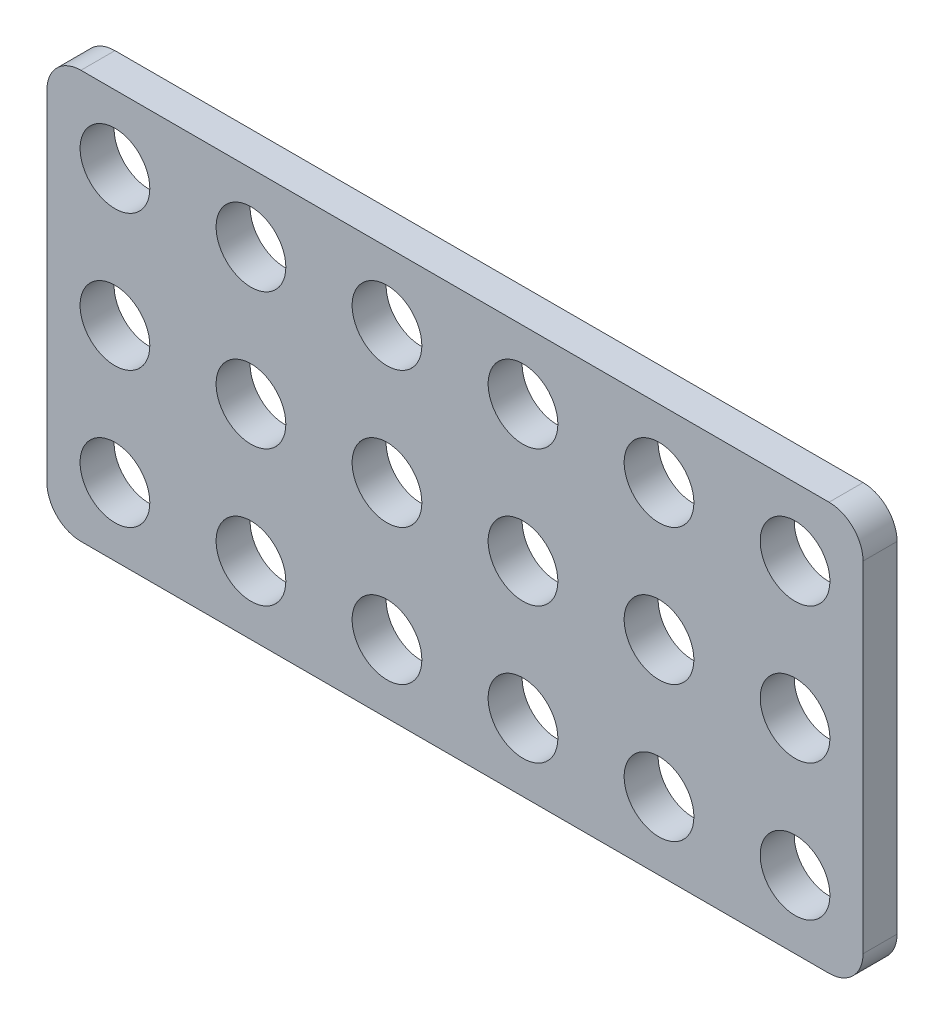
ISO-10303-21;
HEADER;
FILE_DESCRIPTION(('STEP AP214'),'2;1');
FILE_NAME('part.step','',(''),(''),'','','');
FILE_SCHEMA(('AUTOMOTIVE_DESIGN { 1 0 10303 214 1 1 1 1 }'));
ENDSEC;
DATA;
#1=APPLICATION_CONTEXT('core data for automotive mechanical design processes');
#2=APPLICATION_PROTOCOL_DEFINITION('international standard','automotive_design',2000,#1);
#3=PRODUCT_CONTEXT('',#1,'mechanical');
#4=PRODUCT('Part','Part','',(#3));
#5=PRODUCT_RELATED_PRODUCT_CATEGORY('part','',(#4));
#6=PRODUCT_DEFINITION_FORMATION('','',#4);
#7=PRODUCT_DEFINITION_CONTEXT('part definition',#1,'design');
#8=PRODUCT_DEFINITION('design','',#6,#7);
#9=PRODUCT_DEFINITION_SHAPE('','',#8);
#10=(LENGTH_UNIT() NAMED_UNIT(*) SI_UNIT(.MILLI.,.METRE.));
#11=(NAMED_UNIT(*) PLANE_ANGLE_UNIT() SI_UNIT($,.RADIAN.));
#12=(NAMED_UNIT(*) SI_UNIT($,.STERADIAN.) SOLID_ANGLE_UNIT());
#13=UNCERTAINTY_MEASURE_WITH_UNIT(LENGTH_MEASURE(1.E-05),#10,'distance_accuracy_value','');
#14=(GEOMETRIC_REPRESENTATION_CONTEXT(3) GLOBAL_UNCERTAINTY_ASSIGNED_CONTEXT((#13)) GLOBAL_UNIT_ASSIGNED_CONTEXT((#10,
#11,#12)) REPRESENTATION_CONTEXT('',''));
#15=CARTESIAN_POINT('',(0.,0.,0.));
#16=DIRECTION('',(0.,0.,1.));
#17=DIRECTION('',(1.,0.,0.));
#18=AXIS2_PLACEMENT_3D('',#15,#16,#17);
#19=CARTESIAN_POINT('',(44.,4.,0.));
#20=DIRECTION('',(0.,0.,1.));
#21=DIRECTION('',(1.,0.,0.));
#22=AXIS2_PLACEMENT_3D('',#19,#20,#21);
#23=CYLINDRICAL_SURFACE('',#22,2.05);
#24=CARTESIAN_POINT('',(44.,4.,0.));
#25=DIRECTION('',(0.,0.,1.));
#26=DIRECTION('',(1.,0.,0.));
#27=AXIS2_PLACEMENT_3D('',#24,#25,#26);
#28=CIRCLE('',#27,2.05);
#29=CARTESIAN_POINT('',(46.05,4.,0.));
#30=VERTEX_POINT('',#29);
#31=EDGE_CURVE('E228',#30,#30,#28,.T.);
#32=ORIENTED_EDGE('',*,*,#31,.F.);
#33=EDGE_LOOP('',(#32));
#34=FACE_BOUND('',#33,.T.);
#35=CARTESIAN_POINT('',(44.,4.,2.));
#36=DIRECTION('',(0.,0.,1.));
#37=DIRECTION('',(1.,0.,0.));
#38=AXIS2_PLACEMENT_3D('',#35,#36,#37);
#39=CIRCLE('',#38,2.05);
#40=CARTESIAN_POINT('',(46.05,4.,2.));
#41=VERTEX_POINT('',#40);
#42=EDGE_CURVE('E231',#41,#41,#39,.T.);
#43=ORIENTED_EDGE('',*,*,#42,.T.);
#44=EDGE_LOOP('',(#43));
#45=FACE_BOUND('',#44,.T.);
#46=ADVANCED_FACE('F32',(#34,#45),#23,.F.);
#47=CARTESIAN_POINT('',(36.,4.,0.));
#48=DIRECTION('',(0.,0.,1.));
#49=DIRECTION('',(1.,0.,0.));
#50=AXIS2_PLACEMENT_3D('',#47,#48,#49);
#51=CYLINDRICAL_SURFACE('',#50,2.05);
#52=CARTESIAN_POINT('',(36.,4.,0.));
#53=DIRECTION('',(0.,0.,1.));
#54=DIRECTION('',(1.,0.,0.));
#55=AXIS2_PLACEMENT_3D('',#52,#53,#54);
#56=CIRCLE('',#55,2.05);
#57=CARTESIAN_POINT('',(38.05,4.,0.));
#58=VERTEX_POINT('',#57);
#59=EDGE_CURVE('E222',#58,#58,#56,.T.);
#60=ORIENTED_EDGE('',*,*,#59,.F.);
#61=EDGE_LOOP('',(#60));
#62=FACE_BOUND('',#61,.T.);
#63=CARTESIAN_POINT('',(36.,4.,2.));
#64=DIRECTION('',(0.,0.,1.));
#65=DIRECTION('',(1.,0.,0.));
#66=AXIS2_PLACEMENT_3D('',#63,#64,#65);
#67=CIRCLE('',#66,2.05);
#68=CARTESIAN_POINT('',(38.05,4.,2.));
#69=VERTEX_POINT('',#68);
#70=EDGE_CURVE('E225',#69,#69,#67,.T.);
#71=ORIENTED_EDGE('',*,*,#70,.T.);
#72=EDGE_LOOP('',(#71));
#73=FACE_BOUND('',#72,.T.);
#74=ADVANCED_FACE('F333',(#62,#73),#51,.F.);
#75=CARTESIAN_POINT('',(28.,4.,0.));
#76=DIRECTION('',(0.,0.,1.));
#77=DIRECTION('',(1.,0.,0.));
#78=AXIS2_PLACEMENT_3D('',#75,#76,#77);
#79=CYLINDRICAL_SURFACE('',#78,2.05);
#80=CARTESIAN_POINT('',(28.,4.,0.));
#81=DIRECTION('',(0.,0.,1.));
#82=DIRECTION('',(1.,0.,0.));
#83=AXIS2_PLACEMENT_3D('',#80,#81,#82);
#84=CIRCLE('',#83,2.05);
#85=CARTESIAN_POINT('',(30.05,4.,0.));
#86=VERTEX_POINT('',#85);
#87=EDGE_CURVE('E216',#86,#86,#84,.T.);
#88=ORIENTED_EDGE('',*,*,#87,.F.);
#89=EDGE_LOOP('',(#88));
#90=FACE_BOUND('',#89,.T.);
#91=CARTESIAN_POINT('',(28.,4.,2.));
#92=DIRECTION('',(0.,0.,1.));
#93=DIRECTION('',(1.,0.,0.));
#94=AXIS2_PLACEMENT_3D('',#91,#92,#93);
#95=CIRCLE('',#94,2.05);
#96=CARTESIAN_POINT('',(30.05,4.,2.));
#97=VERTEX_POINT('',#96);
#98=EDGE_CURVE('E219',#97,#97,#95,.T.);
#99=ORIENTED_EDGE('',*,*,#98,.T.);
#100=EDGE_LOOP('',(#99));
#101=FACE_BOUND('',#100,.T.);
#102=ADVANCED_FACE('F339',(#90,#101),#79,.F.);
#103=CARTESIAN_POINT('',(20.,4.,0.));
#104=DIRECTION('',(0.,0.,1.));
#105=DIRECTION('',(1.,0.,0.));
#106=AXIS2_PLACEMENT_3D('',#103,#104,#105);
#107=CYLINDRICAL_SURFACE('',#106,2.05);
#108=CARTESIAN_POINT('',(20.,4.,0.));
#109=DIRECTION('',(0.,0.,1.));
#110=DIRECTION('',(1.,0.,0.));
#111=AXIS2_PLACEMENT_3D('',#108,#109,#110);
#112=CIRCLE('',#111,2.05);
#113=CARTESIAN_POINT('',(22.05,4.,0.));
#114=VERTEX_POINT('',#113);
#115=EDGE_CURVE('E210',#114,#114,#112,.T.);
#116=ORIENTED_EDGE('',*,*,#115,.F.);
#117=EDGE_LOOP('',(#116));
#118=FACE_BOUND('',#117,.T.);
#119=CARTESIAN_POINT('',(20.,4.,2.));
#120=DIRECTION('',(0.,0.,1.));
#121=DIRECTION('',(1.,0.,0.));
#122=AXIS2_PLACEMENT_3D('',#119,#120,#121);
#123=CIRCLE('',#122,2.05);
#124=CARTESIAN_POINT('',(22.05,4.,2.));
#125=VERTEX_POINT('',#124);
#126=EDGE_CURVE('E213',#125,#125,#123,.T.);
#127=ORIENTED_EDGE('',*,*,#126,.T.);
#128=EDGE_LOOP('',(#127));
#129=FACE_BOUND('',#128,.T.);
#130=ADVANCED_FACE('F414',(#118,#129),#107,.F.);
#131=CARTESIAN_POINT('',(12.,4.,0.));
#132=DIRECTION('',(0.,0.,1.));
#133=DIRECTION('',(1.,0.,0.));
#134=AXIS2_PLACEMENT_3D('',#131,#132,#133);
#135=CYLINDRICAL_SURFACE('',#134,2.05);
#136=CARTESIAN_POINT('',(12.,4.,0.));
#137=DIRECTION('',(0.,0.,1.));
#138=DIRECTION('',(1.,0.,0.));
#139=AXIS2_PLACEMENT_3D('',#136,#137,#138);
#140=CIRCLE('',#139,2.05);
#141=CARTESIAN_POINT('',(14.05,4.,0.));
#142=VERTEX_POINT('',#141);
#143=EDGE_CURVE('E204',#142,#142,#140,.T.);
#144=ORIENTED_EDGE('',*,*,#143,.F.);
#145=EDGE_LOOP('',(#144));
#146=FACE_BOUND('',#145,.T.);
#147=CARTESIAN_POINT('',(12.,4.,2.));
#148=DIRECTION('',(0.,0.,1.));
#149=DIRECTION('',(1.,0.,0.));
#150=AXIS2_PLACEMENT_3D('',#147,#148,#149);
#151=CIRCLE('',#150,2.05);
#152=CARTESIAN_POINT('',(14.05,4.,2.));
#153=VERTEX_POINT('',#152);
#154=EDGE_CURVE('E207',#153,#153,#151,.T.);
#155=ORIENTED_EDGE('',*,*,#154,.T.);
#156=EDGE_LOOP('',(#155));
#157=FACE_BOUND('',#156,.T.);
#158=ADVANCED_FACE('F410',(#146,#157),#135,.F.);
#159=CARTESIAN_POINT('',(3.99999999999999,4.,0.));
#160=DIRECTION('',(0.,0.,1.));
#161=DIRECTION('',(1.,0.,0.));
#162=AXIS2_PLACEMENT_3D('',#159,#160,#161);
#163=CYLINDRICAL_SURFACE('',#162,2.05);
#164=CARTESIAN_POINT('',(3.99999999999999,4.,0.));
#165=DIRECTION('',(0.,0.,1.));
#166=DIRECTION('',(1.,0.,0.));
#167=AXIS2_PLACEMENT_3D('',#164,#165,#166);
#168=CIRCLE('',#167,2.05);
#169=CARTESIAN_POINT('',(6.04999999999999,4.,0.));
#170=VERTEX_POINT('',#169);
#171=EDGE_CURVE('E198',#170,#170,#168,.T.);
#172=ORIENTED_EDGE('',*,*,#171,.F.);
#173=EDGE_LOOP('',(#172));
#174=FACE_BOUND('',#173,.T.);
#175=CARTESIAN_POINT('',(3.99999999999999,4.,2.));
#176=DIRECTION('',(0.,0.,1.));
#177=DIRECTION('',(1.,0.,0.));
#178=AXIS2_PLACEMENT_3D('',#175,#176,#177);
#179=CIRCLE('',#178,2.05);
#180=CARTESIAN_POINT('',(6.04999999999999,4.,2.));
#181=VERTEX_POINT('',#180);
#182=EDGE_CURVE('E201',#181,#181,#179,.T.);
#183=ORIENTED_EDGE('',*,*,#182,.T.);
#184=EDGE_LOOP('',(#183));
#185=FACE_BOUND('',#184,.T.);
#186=ADVANCED_FACE('F406',(#174,#185),#163,.F.);
#187=CARTESIAN_POINT('',(44.,12.,0.));
#188=DIRECTION('',(0.,0.,1.));
#189=DIRECTION('',(1.,0.,0.));
#190=AXIS2_PLACEMENT_3D('',#187,#188,#189);
#191=CYLINDRICAL_SURFACE('',#190,2.05);
#192=CARTESIAN_POINT('',(44.,12.,0.));
#193=DIRECTION('',(0.,0.,1.));
#194=DIRECTION('',(1.,0.,0.));
#195=AXIS2_PLACEMENT_3D('',#192,#193,#194);
#196=CIRCLE('',#195,2.05);
#197=CARTESIAN_POINT('',(46.05,12.,0.));
#198=VERTEX_POINT('',#197);
#199=EDGE_CURVE('E192',#198,#198,#196,.T.);
#200=ORIENTED_EDGE('',*,*,#199,.F.);
#201=EDGE_LOOP('',(#200));
#202=FACE_BOUND('',#201,.T.);
#203=CARTESIAN_POINT('',(44.,12.,2.));
#204=DIRECTION('',(0.,0.,1.));
#205=DIRECTION('',(1.,0.,0.));
#206=AXIS2_PLACEMENT_3D('',#203,#204,#205);
#207=CIRCLE('',#206,2.05);
#208=CARTESIAN_POINT('',(46.05,12.,2.));
#209=VERTEX_POINT('',#208);
#210=EDGE_CURVE('E195',#209,#209,#207,.T.);
#211=ORIENTED_EDGE('',*,*,#210,.T.);
#212=EDGE_LOOP('',(#211));
#213=FACE_BOUND('',#212,.T.);
#214=ADVANCED_FACE('F402',(#202,#213),#191,.F.);
#215=CARTESIAN_POINT('',(36.,12.,0.));
#216=DIRECTION('',(0.,0.,1.));
#217=DIRECTION('',(1.,0.,0.));
#218=AXIS2_PLACEMENT_3D('',#215,#216,#217);
#219=CYLINDRICAL_SURFACE('',#218,2.05);
#220=CARTESIAN_POINT('',(36.,12.,0.));
#221=DIRECTION('',(0.,0.,1.));
#222=DIRECTION('',(1.,0.,0.));
#223=AXIS2_PLACEMENT_3D('',#220,#221,#222);
#224=CIRCLE('',#223,2.05);
#225=CARTESIAN_POINT('',(38.05,12.,0.));
#226=VERTEX_POINT('',#225);
#227=EDGE_CURVE('E186',#226,#226,#224,.T.);
#228=ORIENTED_EDGE('',*,*,#227,.F.);
#229=EDGE_LOOP('',(#228));
#230=FACE_BOUND('',#229,.T.);
#231=CARTESIAN_POINT('',(36.,12.,2.));
#232=DIRECTION('',(0.,0.,1.));
#233=DIRECTION('',(1.,0.,0.));
#234=AXIS2_PLACEMENT_3D('',#231,#232,#233);
#235=CIRCLE('',#234,2.05);
#236=CARTESIAN_POINT('',(38.05,12.,2.));
#237=VERTEX_POINT('',#236);
#238=EDGE_CURVE('E189',#237,#237,#235,.T.);
#239=ORIENTED_EDGE('',*,*,#238,.T.);
#240=EDGE_LOOP('',(#239));
#241=FACE_BOUND('',#240,.T.);
#242=ADVANCED_FACE('F398',(#230,#241),#219,.F.);
#243=CARTESIAN_POINT('',(28.,12.,0.));
#244=DIRECTION('',(0.,0.,1.));
#245=DIRECTION('',(1.,0.,0.));
#246=AXIS2_PLACEMENT_3D('',#243,#244,#245);
#247=CYLINDRICAL_SURFACE('',#246,2.05);
#248=CARTESIAN_POINT('',(28.,12.,0.));
#249=DIRECTION('',(0.,0.,1.));
#250=DIRECTION('',(1.,0.,0.));
#251=AXIS2_PLACEMENT_3D('',#248,#249,#250);
#252=CIRCLE('',#251,2.05);
#253=CARTESIAN_POINT('',(30.05,12.,0.));
#254=VERTEX_POINT('',#253);
#255=EDGE_CURVE('E180',#254,#254,#252,.T.);
#256=ORIENTED_EDGE('',*,*,#255,.F.);
#257=EDGE_LOOP('',(#256));
#258=FACE_BOUND('',#257,.T.);
#259=CARTESIAN_POINT('',(28.,12.,2.));
#260=DIRECTION('',(0.,0.,1.));
#261=DIRECTION('',(1.,0.,0.));
#262=AXIS2_PLACEMENT_3D('',#259,#260,#261);
#263=CIRCLE('',#262,2.05);
#264=CARTESIAN_POINT('',(30.05,12.,2.));
#265=VERTEX_POINT('',#264);
#266=EDGE_CURVE('E183',#265,#265,#263,.T.);
#267=ORIENTED_EDGE('',*,*,#266,.T.);
#268=EDGE_LOOP('',(#267));
#269=FACE_BOUND('',#268,.T.);
#270=ADVANCED_FACE('F394',(#258,#269),#247,.F.);
#271=CARTESIAN_POINT('',(20.,12.,0.));
#272=DIRECTION('',(0.,0.,1.));
#273=DIRECTION('',(1.,0.,0.));
#274=AXIS2_PLACEMENT_3D('',#271,#272,#273);
#275=CYLINDRICAL_SURFACE('',#274,2.05);
#276=CARTESIAN_POINT('',(20.,12.,0.));
#277=DIRECTION('',(0.,0.,1.));
#278=DIRECTION('',(1.,0.,0.));
#279=AXIS2_PLACEMENT_3D('',#276,#277,#278);
#280=CIRCLE('',#279,2.05);
#281=CARTESIAN_POINT('',(22.05,12.,0.));
#282=VERTEX_POINT('',#281);
#283=EDGE_CURVE('E174',#282,#282,#280,.T.);
#284=ORIENTED_EDGE('',*,*,#283,.F.);
#285=EDGE_LOOP('',(#284));
#286=FACE_BOUND('',#285,.T.);
#287=CARTESIAN_POINT('',(20.,12.,2.));
#288=DIRECTION('',(0.,0.,1.));
#289=DIRECTION('',(1.,0.,0.));
#290=AXIS2_PLACEMENT_3D('',#287,#288,#289);
#291=CIRCLE('',#290,2.05);
#292=CARTESIAN_POINT('',(22.05,12.,2.));
#293=VERTEX_POINT('',#292);
#294=EDGE_CURVE('E177',#293,#293,#291,.T.);
#295=ORIENTED_EDGE('',*,*,#294,.T.);
#296=EDGE_LOOP('',(#295));
#297=FACE_BOUND('',#296,.T.);
#298=ADVANCED_FACE('F390',(#286,#297),#275,.F.);
#299=CARTESIAN_POINT('',(12.,12.,0.));
#300=DIRECTION('',(0.,0.,1.));
#301=DIRECTION('',(1.,0.,0.));
#302=AXIS2_PLACEMENT_3D('',#299,#300,#301);
#303=CYLINDRICAL_SURFACE('',#302,2.05);
#304=CARTESIAN_POINT('',(12.,12.,0.));
#305=DIRECTION('',(0.,0.,1.));
#306=DIRECTION('',(1.,0.,0.));
#307=AXIS2_PLACEMENT_3D('',#304,#305,#306);
#308=CIRCLE('',#307,2.05);
#309=CARTESIAN_POINT('',(14.05,12.,0.));
#310=VERTEX_POINT('',#309);
#311=EDGE_CURVE('E168',#310,#310,#308,.T.);
#312=ORIENTED_EDGE('',*,*,#311,.F.);
#313=EDGE_LOOP('',(#312));
#314=FACE_BOUND('',#313,.T.);
#315=CARTESIAN_POINT('',(12.,12.,2.));
#316=DIRECTION('',(0.,0.,1.));
#317=DIRECTION('',(1.,0.,0.));
#318=AXIS2_PLACEMENT_3D('',#315,#316,#317);
#319=CIRCLE('',#318,2.05);
#320=CARTESIAN_POINT('',(14.05,12.,2.));
#321=VERTEX_POINT('',#320);
#322=EDGE_CURVE('E171',#321,#321,#319,.T.);
#323=ORIENTED_EDGE('',*,*,#322,.T.);
#324=EDGE_LOOP('',(#323));
#325=FACE_BOUND('',#324,.T.);
#326=ADVANCED_FACE('F386',(#314,#325),#303,.F.);
#327=CARTESIAN_POINT('',(3.99999999999999,12.,0.));
#328=DIRECTION('',(0.,0.,1.));
#329=DIRECTION('',(1.,0.,0.));
#330=AXIS2_PLACEMENT_3D('',#327,#328,#329);
#331=CYLINDRICAL_SURFACE('',#330,2.05);
#332=CARTESIAN_POINT('',(3.99999999999999,12.,0.));
#333=DIRECTION('',(0.,0.,1.));
#334=DIRECTION('',(1.,0.,0.));
#335=AXIS2_PLACEMENT_3D('',#332,#333,#334);
#336=CIRCLE('',#335,2.05);
#337=CARTESIAN_POINT('',(6.04999999999999,12.,0.));
#338=VERTEX_POINT('',#337);
#339=EDGE_CURVE('E162',#338,#338,#336,.T.);
#340=ORIENTED_EDGE('',*,*,#339,.F.);
#341=EDGE_LOOP('',(#340));
#342=FACE_BOUND('',#341,.T.);
#343=CARTESIAN_POINT('',(3.99999999999999,12.,2.));
#344=DIRECTION('',(0.,0.,1.));
#345=DIRECTION('',(1.,0.,0.));
#346=AXIS2_PLACEMENT_3D('',#343,#344,#345);
#347=CIRCLE('',#346,2.05);
#348=CARTESIAN_POINT('',(6.04999999999999,12.,2.));
#349=VERTEX_POINT('',#348);
#350=EDGE_CURVE('E165',#349,#349,#347,.T.);
#351=ORIENTED_EDGE('',*,*,#350,.T.);
#352=EDGE_LOOP('',(#351));
#353=FACE_BOUND('',#352,.T.);
#354=ADVANCED_FACE('F382',(#342,#353),#331,.F.);
#355=CARTESIAN_POINT('',(44.,20.,0.));
#356=DIRECTION('',(0.,0.,1.));
#357=DIRECTION('',(1.,0.,0.));
#358=AXIS2_PLACEMENT_3D('',#355,#356,#357);
#359=CYLINDRICAL_SURFACE('',#358,2.05);
#360=CARTESIAN_POINT('',(44.,20.,0.));
#361=DIRECTION('',(0.,0.,1.));
#362=DIRECTION('',(1.,0.,0.));
#363=AXIS2_PLACEMENT_3D('',#360,#361,#362);
#364=CIRCLE('',#363,2.05);
#365=CARTESIAN_POINT('',(46.05,20.,0.));
#366=VERTEX_POINT('',#365);
#367=EDGE_CURVE('E156',#366,#366,#364,.T.);
#368=ORIENTED_EDGE('',*,*,#367,.F.);
#369=EDGE_LOOP('',(#368));
#370=FACE_BOUND('',#369,.T.);
#371=CARTESIAN_POINT('',(44.,20.,2.));
#372=DIRECTION('',(0.,0.,1.));
#373=DIRECTION('',(1.,0.,0.));
#374=AXIS2_PLACEMENT_3D('',#371,#372,#373);
#375=CIRCLE('',#374,2.05);
#376=CARTESIAN_POINT('',(46.05,20.,2.));
#377=VERTEX_POINT('',#376);
#378=EDGE_CURVE('E159',#377,#377,#375,.T.);
#379=ORIENTED_EDGE('',*,*,#378,.T.);
#380=EDGE_LOOP('',(#379));
#381=FACE_BOUND('',#380,.T.);
#382=ADVANCED_FACE('F378',(#370,#381),#359,.F.);
#383=CARTESIAN_POINT('',(36.,20.,0.));
#384=DIRECTION('',(0.,0.,1.));
#385=DIRECTION('',(1.,0.,0.));
#386=AXIS2_PLACEMENT_3D('',#383,#384,#385);
#387=CYLINDRICAL_SURFACE('',#386,2.05);
#388=CARTESIAN_POINT('',(36.,20.,0.));
#389=DIRECTION('',(0.,0.,1.));
#390=DIRECTION('',(1.,0.,0.));
#391=AXIS2_PLACEMENT_3D('',#388,#389,#390);
#392=CIRCLE('',#391,2.05);
#393=CARTESIAN_POINT('',(38.05,20.,0.));
#394=VERTEX_POINT('',#393);
#395=EDGE_CURVE('E150',#394,#394,#392,.T.);
#396=ORIENTED_EDGE('',*,*,#395,.F.);
#397=EDGE_LOOP('',(#396));
#398=FACE_BOUND('',#397,.T.);
#399=CARTESIAN_POINT('',(36.,20.,2.));
#400=DIRECTION('',(0.,0.,1.));
#401=DIRECTION('',(1.,0.,0.));
#402=AXIS2_PLACEMENT_3D('',#399,#400,#401);
#403=CIRCLE('',#402,2.05);
#404=CARTESIAN_POINT('',(38.05,20.,2.));
#405=VERTEX_POINT('',#404);
#406=EDGE_CURVE('E153',#405,#405,#403,.T.);
#407=ORIENTED_EDGE('',*,*,#406,.T.);
#408=EDGE_LOOP('',(#407));
#409=FACE_BOUND('',#408,.T.);
#410=ADVANCED_FACE('F374',(#398,#409),#387,.F.);
#411=CARTESIAN_POINT('',(28.,20.,0.));
#412=DIRECTION('',(0.,0.,1.));
#413=DIRECTION('',(1.,0.,0.));
#414=AXIS2_PLACEMENT_3D('',#411,#412,#413);
#415=CYLINDRICAL_SURFACE('',#414,2.05);
#416=CARTESIAN_POINT('',(28.,20.,0.));
#417=DIRECTION('',(0.,0.,1.));
#418=DIRECTION('',(1.,0.,0.));
#419=AXIS2_PLACEMENT_3D('',#416,#417,#418);
#420=CIRCLE('',#419,2.05);
#421=CARTESIAN_POINT('',(30.05,20.,0.));
#422=VERTEX_POINT('',#421);
#423=EDGE_CURVE('E144',#422,#422,#420,.T.);
#424=ORIENTED_EDGE('',*,*,#423,.F.);
#425=EDGE_LOOP('',(#424));
#426=FACE_BOUND('',#425,.T.);
#427=CARTESIAN_POINT('',(28.,20.,2.));
#428=DIRECTION('',(0.,0.,1.));
#429=DIRECTION('',(1.,0.,0.));
#430=AXIS2_PLACEMENT_3D('',#427,#428,#429);
#431=CIRCLE('',#430,2.05);
#432=CARTESIAN_POINT('',(30.05,20.,2.));
#433=VERTEX_POINT('',#432);
#434=EDGE_CURVE('E147',#433,#433,#431,.T.);
#435=ORIENTED_EDGE('',*,*,#434,.T.);
#436=EDGE_LOOP('',(#435));
#437=FACE_BOUND('',#436,.T.);
#438=ADVANCED_FACE('F367',(#426,#437),#415,.F.);
#439=CARTESIAN_POINT('',(20.,20.,0.));
#440=DIRECTION('',(0.,0.,1.));
#441=DIRECTION('',(1.,0.,0.));
#442=AXIS2_PLACEMENT_3D('',#439,#440,#441);
#443=CYLINDRICAL_SURFACE('',#442,2.05);
#444=CARTESIAN_POINT('',(20.,20.,0.));
#445=DIRECTION('',(0.,0.,1.));
#446=DIRECTION('',(1.,0.,0.));
#447=AXIS2_PLACEMENT_3D('',#444,#445,#446);
#448=CIRCLE('',#447,2.05);
#449=CARTESIAN_POINT('',(22.05,20.,0.));
#450=VERTEX_POINT('',#449);
#451=EDGE_CURVE('E137',#450,#450,#448,.T.);
#452=ORIENTED_EDGE('',*,*,#451,.F.);
#453=EDGE_LOOP('',(#452));
#454=FACE_BOUND('',#453,.T.);
#455=CARTESIAN_POINT('',(20.,20.,2.));
#456=DIRECTION('',(0.,0.,1.));
#457=DIRECTION('',(1.,0.,0.));
#458=AXIS2_PLACEMENT_3D('',#455,#456,#457);
#459=CIRCLE('',#458,2.05);
#460=CARTESIAN_POINT('',(22.05,20.,2.));
#461=VERTEX_POINT('',#460);
#462=EDGE_CURVE('E140',#461,#461,#459,.T.);
#463=ORIENTED_EDGE('',*,*,#462,.T.);
#464=EDGE_LOOP('',(#463));
#465=FACE_BOUND('',#464,.T.);
#466=ADVANCED_FACE('F360',(#454,#465),#443,.F.);
#467=CARTESIAN_POINT('',(0.,0.,2.));
#468=DIRECTION('',(1.,0.,0.));
#469=DIRECTION('',(0.,1.,0.));
#470=AXIS2_PLACEMENT_3D('',#467,#468,#469);
#471=PLANE('',#470);
#472=DIRECTION('',(0.,-1.,0.));
#473=VECTOR('',#472,1.);
#474=CARTESIAN_POINT('',(0.,0.,0.));
#475=LINE('',#474,#473);
#476=CARTESIAN_POINT('',(0.,22.,0.));
#477=VERTEX_POINT('',#476);
#478=CARTESIAN_POINT('',(0.,2.,0.));
#479=VERTEX_POINT('',#478);
#480=EDGE_CURVE('E126',#477,#479,#475,.T.);
#481=ORIENTED_EDGE('',*,*,#480,.T.);
#482=DIRECTION('',(0.,0.,-1.));
#483=VECTOR('',#482,1.);
#484=CARTESIAN_POINT('',(0.,2.,2.));
#485=LINE('',#484,#483);
#486=CARTESIAN_POINT('',(0.,2.,2.));
#487=VERTEX_POINT('',#486);
#488=EDGE_CURVE('E103',#479,#487,#485,.F.);
#489=ORIENTED_EDGE('',*,*,#488,.T.);
#490=DIRECTION('',(0.,-1.,0.));
#491=VECTOR('',#490,1.);
#492=CARTESIAN_POINT('',(0.,0.,2.));
#493=LINE('',#492,#491);
#494=CARTESIAN_POINT('',(0.,22.,2.));
#495=VERTEX_POINT('',#494);
#496=EDGE_CURVE('E136',#495,#487,#493,.T.);
#497=ORIENTED_EDGE('',*,*,#496,.F.);
#498=DIRECTION('',(0.,0.,-1.));
#499=VECTOR('',#498,1.);
#500=CARTESIAN_POINT('',(0.,22.,2.));
#501=LINE('',#500,#499);
#502=EDGE_CURVE('E108',#495,#477,#501,.T.);
#503=ORIENTED_EDGE('',*,*,#502,.T.);
#504=EDGE_LOOP('',(#481,#489,#497,#503));
#505=FACE_BOUND('',#504,.T.);
#506=ADVANCED_FACE('F358',(#505),#471,.F.);
#507=CARTESIAN_POINT('',(0.,0.,2.));
#508=DIRECTION('',(0.,1.,0.));
#509=DIRECTION('',(0.,0.,1.));
#510=AXIS2_PLACEMENT_3D('',#507,#508,#509);
#511=PLANE('',#510);
#512=DIRECTION('',(1.,0.,0.));
#513=VECTOR('',#512,1.);
#514=CARTESIAN_POINT('',(0.,0.,2.));
#515=LINE('',#514,#513);
#516=CARTESIAN_POINT('',(2.,0.,2.));
#517=VERTEX_POINT('',#516);
#518=CARTESIAN_POINT('',(46.,0.,2.));
#519=VERTEX_POINT('',#518);
#520=EDGE_CURVE('E118',#517,#519,#515,.T.);
#521=ORIENTED_EDGE('',*,*,#520,.F.);
#522=DIRECTION('',(0.,0.,-1.));
#523=VECTOR('',#522,1.);
#524=CARTESIAN_POINT('',(2.,0.,2.));
#525=LINE('',#524,#523);
#526=CARTESIAN_POINT('',(2.,0.,0.));
#527=VERTEX_POINT('',#526);
#528=EDGE_CURVE('E102',#517,#527,#525,.T.);
#529=ORIENTED_EDGE('',*,*,#528,.T.);
#530=DIRECTION('',(1.,0.,0.));
#531=VECTOR('',#530,1.);
#532=CARTESIAN_POINT('',(0.,0.,0.));
#533=LINE('',#532,#531);
#534=CARTESIAN_POINT('',(46.,0.,0.));
#535=VERTEX_POINT('',#534);
#536=EDGE_CURVE('E115',#527,#535,#533,.T.);
#537=ORIENTED_EDGE('',*,*,#536,.T.);
#538=DIRECTION('',(0.,0.,-1.));
#539=VECTOR('',#538,1.);
#540=CARTESIAN_POINT('',(46.,0.,2.));
#541=LINE('',#540,#539);
#542=EDGE_CURVE('E120',#535,#519,#541,.F.);
#543=ORIENTED_EDGE('',*,*,#542,.T.);
#544=EDGE_LOOP('',(#521,#529,#537,#543));
#545=FACE_BOUND('',#544,.T.);
#546=ADVANCED_FACE('F114',(#545),#511,.F.);
#547=CARTESIAN_POINT('',(48.,0.,2.));
#548=DIRECTION('',(-1.,0.,0.));
#549=DIRECTION('',(0.,-1.,0.));
#550=AXIS2_PLACEMENT_3D('',#547,#548,#549);
#551=PLANE('',#550);
#552=DIRECTION('',(0.,1.,0.));
#553=VECTOR('',#552,1.);
#554=CARTESIAN_POINT('',(48.,0.,2.));
#555=LINE('',#554,#553);
#556=CARTESIAN_POINT('',(48.,2.,2.));
#557=VERTEX_POINT('',#556);
#558=CARTESIAN_POINT('',(48.,22.,2.));
#559=VERTEX_POINT('',#558);
#560=EDGE_CURVE('E258',#557,#559,#555,.T.);
#561=ORIENTED_EDGE('',*,*,#560,.F.);
#562=DIRECTION('',(0.,0.,-1.));
#563=VECTOR('',#562,1.);
#564=CARTESIAN_POINT('',(48.,2.,2.));
#565=LINE('',#564,#563);
#566=CARTESIAN_POINT('',(48.,2.,0.));
#567=VERTEX_POINT('',#566);
#568=EDGE_CURVE('E251',#557,#567,#565,.T.);
#569=ORIENTED_EDGE('',*,*,#568,.T.);
#570=DIRECTION('',(0.,1.,0.));
#571=VECTOR('',#570,1.);
#572=CARTESIAN_POINT('',(48.,0.,0.));
#573=LINE('',#572,#571);
#574=CARTESIAN_POINT('',(48.,22.,0.));
#575=VERTEX_POINT('',#574);
#576=EDGE_CURVE('E125',#567,#575,#573,.T.);
#577=ORIENTED_EDGE('',*,*,#576,.T.);
#578=DIRECTION('',(0.,0.,-1.));
#579=VECTOR('',#578,1.);
#580=CARTESIAN_POINT('',(48.,22.,2.));
#581=LINE('',#580,#579);
#582=EDGE_CURVE('E249',#575,#559,#581,.F.);
#583=ORIENTED_EDGE('',*,*,#582,.T.);
#584=EDGE_LOOP('',(#561,#569,#577,#583));
#585=FACE_BOUND('',#584,.T.);
#586=ADVANCED_FACE('F256',(#585),#551,.F.);
#587=CARTESIAN_POINT('',(0.,24.,2.));
#588=DIRECTION('',(0.,-1.,0.));
#589=DIRECTION('',(0.,0.,-1.));
#590=AXIS2_PLACEMENT_3D('',#587,#588,#589);
#591=PLANE('',#590);
#592=DIRECTION('',(-1.,0.,0.));
#593=VECTOR('',#592,1.);
#594=CARTESIAN_POINT('',(0.,24.,2.));
#595=LINE('',#594,#593);
#596=CARTESIAN_POINT('',(46.,24.,2.));
#597=VERTEX_POINT('',#596);
#598=CARTESIAN_POINT('',(1.99999999999999,24.,2.));
#599=VERTEX_POINT('',#598);
#600=EDGE_CURVE('E141',#597,#599,#595,.T.);
#601=ORIENTED_EDGE('',*,*,#600,.F.);
#602=DIRECTION('',(0.,0.,-1.));
#603=VECTOR('',#602,1.);
#604=CARTESIAN_POINT('',(46.,24.,2.));
#605=LINE('',#604,#603);
#606=CARTESIAN_POINT('',(46.,24.,0.));
#607=VERTEX_POINT('',#606);
#608=EDGE_CURVE('E11',#597,#607,#605,.T.);
#609=ORIENTED_EDGE('',*,*,#608,.T.);
#610=DIRECTION('',(-1.,0.,0.));
#611=VECTOR('',#610,1.);
#612=CARTESIAN_POINT('',(0.,24.,0.));
#613=LINE('',#612,#611);
#614=CARTESIAN_POINT('',(1.99999999999999,24.,0.));
#615=VERTEX_POINT('',#614);
#616=EDGE_CURVE('E129',#607,#615,#613,.T.);
#617=ORIENTED_EDGE('',*,*,#616,.T.);
#618=DIRECTION('',(0.,0.,-1.));
#619=VECTOR('',#618,1.);
#620=CARTESIAN_POINT('',(1.99999999999999,24.,2.));
#621=LINE('',#620,#619);
#622=EDGE_CURVE('E40',#615,#599,#621,.F.);
#623=ORIENTED_EDGE('',*,*,#622,.T.);
#624=EDGE_LOOP('',(#601,#609,#617,#623));
#625=FACE_BOUND('',#624,.T.);
#626=ADVANCED_FACE('F265',(#625),#591,.F.);
#627=CARTESIAN_POINT('',(0.,0.,2.));
#628=DIRECTION('',(0.,0.,-1.));
#629=DIRECTION('',(-1.,0.,0.));
#630=AXIS2_PLACEMENT_3D('',#627,#628,#629);
#631=PLANE('',#630);
#632=CARTESIAN_POINT('',(12.,20.,2.));
#633=DIRECTION('',(0.,0.,1.));
#634=DIRECTION('',(1.,0.,0.));
#635=AXIS2_PLACEMENT_3D('',#632,#633,#634);
#636=CIRCLE('',#635,2.05);
#637=CARTESIAN_POINT('',(14.05,20.,2.));
#638=VERTEX_POINT('',#637);
#639=EDGE_CURVE('E275',#638,#638,#636,.T.);
#640=ORIENTED_EDGE('',*,*,#639,.F.);
#641=EDGE_LOOP('',(#640));
#642=FACE_BOUND('',#641,.T.);
#643=CARTESIAN_POINT('',(3.99999999999999,20.,2.));
#644=DIRECTION('',(0.,0.,1.));
#645=DIRECTION('',(1.,0.,0.));
#646=AXIS2_PLACEMENT_3D('',#643,#644,#645);
#647=CIRCLE('',#646,2.05);
#648=CARTESIAN_POINT('',(6.04999999999999,20.,2.));
#649=VERTEX_POINT('',#648);
#650=EDGE_CURVE('E272',#649,#649,#647,.T.);
#651=ORIENTED_EDGE('',*,*,#650,.F.);
#652=EDGE_LOOP('',(#651));
#653=FACE_BOUND('',#652,.T.);
#654=ORIENTED_EDGE('',*,*,#496,.T.);
#655=CARTESIAN_POINT('',(2.,2.,2.));
#656=DIRECTION('',(0.,0.,-1.));
#657=DIRECTION('',(-1.,0.,0.));
#658=AXIS2_PLACEMENT_3D('',#655,#656,#657);
#659=CIRCLE('',#658,2.);
#660=EDGE_CURVE('E247',#487,#517,#659,.F.);
#661=ORIENTED_EDGE('',*,*,#660,.T.);
#662=ORIENTED_EDGE('',*,*,#520,.T.);
#663=CARTESIAN_POINT('',(46.,2.,2.));
#664=DIRECTION('',(0.,0.,-1.));
#665=DIRECTION('',(-1.,0.,0.));
#666=AXIS2_PLACEMENT_3D('',#663,#664,#665);
#667=CIRCLE('',#666,2.);
#668=EDGE_CURVE('E245',#519,#557,#667,.F.);
#669=ORIENTED_EDGE('',*,*,#668,.T.);
#670=ORIENTED_EDGE('',*,*,#560,.T.);
#671=CARTESIAN_POINT('',(46.,22.,2.));
#672=DIRECTION('',(0.,0.,-1.));
#673=DIRECTION('',(-1.,0.,0.));
#674=AXIS2_PLACEMENT_3D('',#671,#672,#673);
#675=CIRCLE('',#674,2.);
#676=EDGE_CURVE('E53',#559,#597,#675,.F.);
#677=ORIENTED_EDGE('',*,*,#676,.T.);
#678=ORIENTED_EDGE('',*,*,#600,.T.);
#679=CARTESIAN_POINT('',(1.99999999999999,22.,2.));
#680=DIRECTION('',(0.,0.,-1.));
#681=DIRECTION('',(-1.,0.,0.));
#682=AXIS2_PLACEMENT_3D('',#679,#680,#681);
#683=CIRCLE('',#682,2.);
#684=EDGE_CURVE('E242',#599,#495,#683,.F.);
#685=ORIENTED_EDGE('',*,*,#684,.T.);
#686=EDGE_LOOP('',(#654,#661,#662,#669,#670,#677,#678,#685));
#687=FACE_BOUND('',#686,.T.);
#688=ORIENTED_EDGE('',*,*,#462,.F.);
#689=EDGE_LOOP('',(#688));
#690=FACE_BOUND('',#689,.T.);
#691=ORIENTED_EDGE('',*,*,#434,.F.);
#692=EDGE_LOOP('',(#691));
#693=FACE_BOUND('',#692,.T.);
#694=ORIENTED_EDGE('',*,*,#406,.F.);
#695=EDGE_LOOP('',(#694));
#696=FACE_BOUND('',#695,.T.);
#697=ORIENTED_EDGE('',*,*,#378,.F.);
#698=EDGE_LOOP('',(#697));
#699=FACE_BOUND('',#698,.T.);
#700=ORIENTED_EDGE('',*,*,#350,.F.);
#701=EDGE_LOOP('',(#700));
#702=FACE_BOUND('',#701,.T.);
#703=ORIENTED_EDGE('',*,*,#322,.F.);
#704=EDGE_LOOP('',(#703));
#705=FACE_BOUND('',#704,.T.);
#706=ORIENTED_EDGE('',*,*,#294,.F.);
#707=EDGE_LOOP('',(#706));
#708=FACE_BOUND('',#707,.T.);
#709=ORIENTED_EDGE('',*,*,#266,.F.);
#710=EDGE_LOOP('',(#709));
#711=FACE_BOUND('',#710,.T.);
#712=ORIENTED_EDGE('',*,*,#238,.F.);
#713=EDGE_LOOP('',(#712));
#714=FACE_BOUND('',#713,.T.);
#715=ORIENTED_EDGE('',*,*,#210,.F.);
#716=EDGE_LOOP('',(#715));
#717=FACE_BOUND('',#716,.T.);
#718=ORIENTED_EDGE('',*,*,#182,.F.);
#719=EDGE_LOOP('',(#718));
#720=FACE_BOUND('',#719,.T.);
#721=ORIENTED_EDGE('',*,*,#154,.F.);
#722=EDGE_LOOP('',(#721));
#723=FACE_BOUND('',#722,.T.);
#724=ORIENTED_EDGE('',*,*,#126,.F.);
#725=EDGE_LOOP('',(#724));
#726=FACE_BOUND('',#725,.T.);
#727=ORIENTED_EDGE('',*,*,#98,.F.);
#728=EDGE_LOOP('',(#727));
#729=FACE_BOUND('',#728,.T.);
#730=ORIENTED_EDGE('',*,*,#70,.F.);
#731=EDGE_LOOP('',(#730));
#732=FACE_BOUND('',#731,.T.);
#733=ORIENTED_EDGE('',*,*,#42,.F.);
#734=EDGE_LOOP('',(#733));
#735=FACE_BOUND('',#734,.T.);
#736=ADVANCED_FACE('F293',(#642,#653,#687,#690,#693,#696,#699,#702,#705,#708,#711,#714,#717,
#720,#723,#726,#729,#732,#735),#631,.F.);
#737=CARTESIAN_POINT('',(0.,0.,0.));
#738=DIRECTION('',(0.,0.,-1.));
#739=DIRECTION('',(-1.,0.,0.));
#740=AXIS2_PLACEMENT_3D('',#737,#738,#739);
#741=PLANE('',#740);
#742=CARTESIAN_POINT('',(12.,20.,0.));
#743=DIRECTION('',(0.,0.,1.));
#744=DIRECTION('',(1.,0.,0.));
#745=AXIS2_PLACEMENT_3D('',#742,#743,#744);
#746=CIRCLE('',#745,2.05);
#747=CARTESIAN_POINT('',(14.05,20.,0.));
#748=VERTEX_POINT('',#747);
#749=EDGE_CURVE('E280',#748,#748,#746,.T.);
#750=ORIENTED_EDGE('',*,*,#749,.T.);
#751=EDGE_LOOP('',(#750));
#752=FACE_BOUND('',#751,.T.);
#753=CARTESIAN_POINT('',(3.99999999999999,20.,0.));
#754=DIRECTION('',(0.,0.,1.));
#755=DIRECTION('',(1.,0.,0.));
#756=AXIS2_PLACEMENT_3D('',#753,#754,#755);
#757=CIRCLE('',#756,2.05);
#758=CARTESIAN_POINT('',(6.04999999999999,20.,0.));
#759=VERTEX_POINT('',#758);
#760=EDGE_CURVE('E131',#759,#759,#757,.T.);
#761=ORIENTED_EDGE('',*,*,#760,.T.);
#762=EDGE_LOOP('',(#761));
#763=FACE_BOUND('',#762,.T.);
#764=ORIENTED_EDGE('',*,*,#536,.F.);
#765=CARTESIAN_POINT('',(2.,2.,0.));
#766=DIRECTION('',(0.,0.,-1.));
#767=DIRECTION('',(-1.,0.,0.));
#768=AXIS2_PLACEMENT_3D('',#765,#766,#767);
#769=CIRCLE('',#768,2.);
#770=EDGE_CURVE('E98',#527,#479,#769,.T.);
#771=ORIENTED_EDGE('',*,*,#770,.T.);
#772=ORIENTED_EDGE('',*,*,#480,.F.);
#773=CARTESIAN_POINT('',(1.99999999999999,22.,0.));
#774=DIRECTION('',(0.,0.,-1.));
#775=DIRECTION('',(-1.,0.,0.));
#776=AXIS2_PLACEMENT_3D('',#773,#774,#775);
#777=CIRCLE('',#776,2.);
#778=EDGE_CURVE('E119',#477,#615,#777,.T.);
#779=ORIENTED_EDGE('',*,*,#778,.T.);
#780=ORIENTED_EDGE('',*,*,#616,.F.);
#781=CARTESIAN_POINT('',(46.,22.,0.));
#782=DIRECTION('',(0.,0.,-1.));
#783=DIRECTION('',(-1.,0.,0.));
#784=AXIS2_PLACEMENT_3D('',#781,#782,#783);
#785=CIRCLE('',#784,2.);
#786=EDGE_CURVE('E236',#607,#575,#785,.T.);
#787=ORIENTED_EDGE('',*,*,#786,.T.);
#788=ORIENTED_EDGE('',*,*,#576,.F.);
#789=CARTESIAN_POINT('',(46.,2.,0.));
#790=DIRECTION('',(0.,0.,-1.));
#791=DIRECTION('',(-1.,0.,0.));
#792=AXIS2_PLACEMENT_3D('',#789,#790,#791);
#793=CIRCLE('',#792,2.);
#794=EDGE_CURVE('E109',#567,#535,#793,.T.);
#795=ORIENTED_EDGE('',*,*,#794,.T.);
#796=EDGE_LOOP('',(#764,#771,#772,#779,#780,#787,#788,#795));
#797=FACE_BOUND('',#796,.T.);
#798=ORIENTED_EDGE('',*,*,#451,.T.);
#799=EDGE_LOOP('',(#798));
#800=FACE_BOUND('',#799,.T.);
#801=ORIENTED_EDGE('',*,*,#423,.T.);
#802=EDGE_LOOP('',(#801));
#803=FACE_BOUND('',#802,.T.);
#804=ORIENTED_EDGE('',*,*,#395,.T.);
#805=EDGE_LOOP('',(#804));
#806=FACE_BOUND('',#805,.T.);
#807=ORIENTED_EDGE('',*,*,#367,.T.);
#808=EDGE_LOOP('',(#807));
#809=FACE_BOUND('',#808,.T.);
#810=ORIENTED_EDGE('',*,*,#339,.T.);
#811=EDGE_LOOP('',(#810));
#812=FACE_BOUND('',#811,.T.);
#813=ORIENTED_EDGE('',*,*,#311,.T.);
#814=EDGE_LOOP('',(#813));
#815=FACE_BOUND('',#814,.T.);
#816=ORIENTED_EDGE('',*,*,#283,.T.);
#817=EDGE_LOOP('',(#816));
#818=FACE_BOUND('',#817,.T.);
#819=ORIENTED_EDGE('',*,*,#255,.T.);
#820=EDGE_LOOP('',(#819));
#821=FACE_BOUND('',#820,.T.);
#822=ORIENTED_EDGE('',*,*,#227,.T.);
#823=EDGE_LOOP('',(#822));
#824=FACE_BOUND('',#823,.T.);
#825=ORIENTED_EDGE('',*,*,#199,.T.);
#826=EDGE_LOOP('',(#825));
#827=FACE_BOUND('',#826,.T.);
#828=ORIENTED_EDGE('',*,*,#171,.T.);
#829=EDGE_LOOP('',(#828));
#830=FACE_BOUND('',#829,.T.);
#831=ORIENTED_EDGE('',*,*,#143,.T.);
#832=EDGE_LOOP('',(#831));
#833=FACE_BOUND('',#832,.T.);
#834=ORIENTED_EDGE('',*,*,#115,.T.);
#835=EDGE_LOOP('',(#834));
#836=FACE_BOUND('',#835,.T.);
#837=ORIENTED_EDGE('',*,*,#87,.T.);
#838=EDGE_LOOP('',(#837));
#839=FACE_BOUND('',#838,.T.);
#840=ORIENTED_EDGE('',*,*,#59,.T.);
#841=EDGE_LOOP('',(#840));
#842=FACE_BOUND('',#841,.T.);
#843=ORIENTED_EDGE('',*,*,#31,.T.);
#844=EDGE_LOOP('',(#843));
#845=FACE_BOUND('',#844,.T.);
#846=ADVANCED_FACE('F122',(#752,#763,#797,#800,#803,#806,#809,#812,#815,#818,#821,#824,#827,
#830,#833,#836,#839,#842,#845),#741,.T.);
#847=CARTESIAN_POINT('',(3.99999999999999,20.,0.));
#848=DIRECTION('',(0.,0.,1.));
#849=DIRECTION('',(1.,0.,0.));
#850=AXIS2_PLACEMENT_3D('',#847,#848,#849);
#851=CYLINDRICAL_SURFACE('',#850,2.05);
#852=ORIENTED_EDGE('',*,*,#760,.F.);
#853=EDGE_LOOP('',(#852));
#854=FACE_BOUND('',#853,.T.);
#855=ORIENTED_EDGE('',*,*,#650,.T.);
#856=EDGE_LOOP('',(#855));
#857=FACE_BOUND('',#856,.T.);
#858=ADVANCED_FACE('F289',(#854,#857),#851,.F.);
#859=CARTESIAN_POINT('',(12.,20.,0.));
#860=DIRECTION('',(0.,0.,1.));
#861=DIRECTION('',(1.,0.,0.));
#862=AXIS2_PLACEMENT_3D('',#859,#860,#861);
#863=CYLINDRICAL_SURFACE('',#862,2.05);
#864=ORIENTED_EDGE('',*,*,#749,.F.);
#865=EDGE_LOOP('',(#864));
#866=FACE_BOUND('',#865,.T.);
#867=ORIENTED_EDGE('',*,*,#639,.T.);
#868=EDGE_LOOP('',(#867));
#869=FACE_BOUND('',#868,.T.);
#870=ADVANCED_FACE('F286',(#866,#869),#863,.F.);
#871=CARTESIAN_POINT('',(2.,2.,2.));
#872=DIRECTION('',(0.,0.,-1.));
#873=DIRECTION('',(-1.,0.,0.));
#874=AXIS2_PLACEMENT_3D('',#871,#872,#873);
#875=CYLINDRICAL_SURFACE('',#874,2.);
#876=ORIENTED_EDGE('',*,*,#660,.F.);
#877=ORIENTED_EDGE('',*,*,#488,.F.);
#878=ORIENTED_EDGE('',*,*,#770,.F.);
#879=ORIENTED_EDGE('',*,*,#528,.F.);
#880=EDGE_LOOP('',(#876,#877,#878,#879));
#881=FACE_BOUND('',#880,.T.);
#882=ADVANCED_FACE('F101',(#881),#875,.T.);
#883=CARTESIAN_POINT('',(46.,2.,2.));
#884=DIRECTION('',(0.,0.,-1.));
#885=DIRECTION('',(-1.,0.,0.));
#886=AXIS2_PLACEMENT_3D('',#883,#884,#885);
#887=CYLINDRICAL_SURFACE('',#886,2.);
#888=ORIENTED_EDGE('',*,*,#668,.F.);
#889=ORIENTED_EDGE('',*,*,#542,.F.);
#890=ORIENTED_EDGE('',*,*,#794,.F.);
#891=ORIENTED_EDGE('',*,*,#568,.F.);
#892=EDGE_LOOP('',(#888,#889,#890,#891));
#893=FACE_BOUND('',#892,.T.);
#894=ADVANCED_FACE('F347',(#893),#887,.T.);
#895=CARTESIAN_POINT('',(46.,22.,2.));
#896=DIRECTION('',(0.,0.,-1.));
#897=DIRECTION('',(-1.,0.,0.));
#898=AXIS2_PLACEMENT_3D('',#895,#896,#897);
#899=CYLINDRICAL_SURFACE('',#898,2.);
#900=ORIENTED_EDGE('',*,*,#676,.F.);
#901=ORIENTED_EDGE('',*,*,#582,.F.);
#902=ORIENTED_EDGE('',*,*,#786,.F.);
#903=ORIENTED_EDGE('',*,*,#608,.F.);
#904=EDGE_LOOP('',(#900,#901,#902,#903));
#905=FACE_BOUND('',#904,.T.);
#906=ADVANCED_FACE('F264',(#905),#899,.T.);
#907=CARTESIAN_POINT('',(1.99999999999999,22.,2.));
#908=DIRECTION('',(0.,0.,-1.));
#909=DIRECTION('',(-1.,0.,0.));
#910=AXIS2_PLACEMENT_3D('',#907,#908,#909);
#911=CYLINDRICAL_SURFACE('',#910,2.);
#912=ORIENTED_EDGE('',*,*,#684,.F.);
#913=ORIENTED_EDGE('',*,*,#622,.F.);
#914=ORIENTED_EDGE('',*,*,#778,.F.);
#915=ORIENTED_EDGE('',*,*,#502,.F.);
#916=EDGE_LOOP('',(#912,#913,#914,#915));
#917=FACE_BOUND('',#916,.T.);
#918=ADVANCED_FACE('F34',(#917),#911,.T.);
#919=CLOSED_SHELL('',(#46,#74,#102,#130,#158,#186,#214,#242,#270,#298,#326,#354,#382,#410,#438,
#466,#506,#546,#586,#626,#736,#846,#858,#870,#882,#894,#906,#918));
#920=MANIFOLD_SOLID_BREP('B2',#919);
#921=ADVANCED_BREP_SHAPE_REPRESENTATION('',(#18,#920),#14);
#922=SHAPE_DEFINITION_REPRESENTATION(#9,#921);
ENDSEC;
END-ISO-10303-21;
